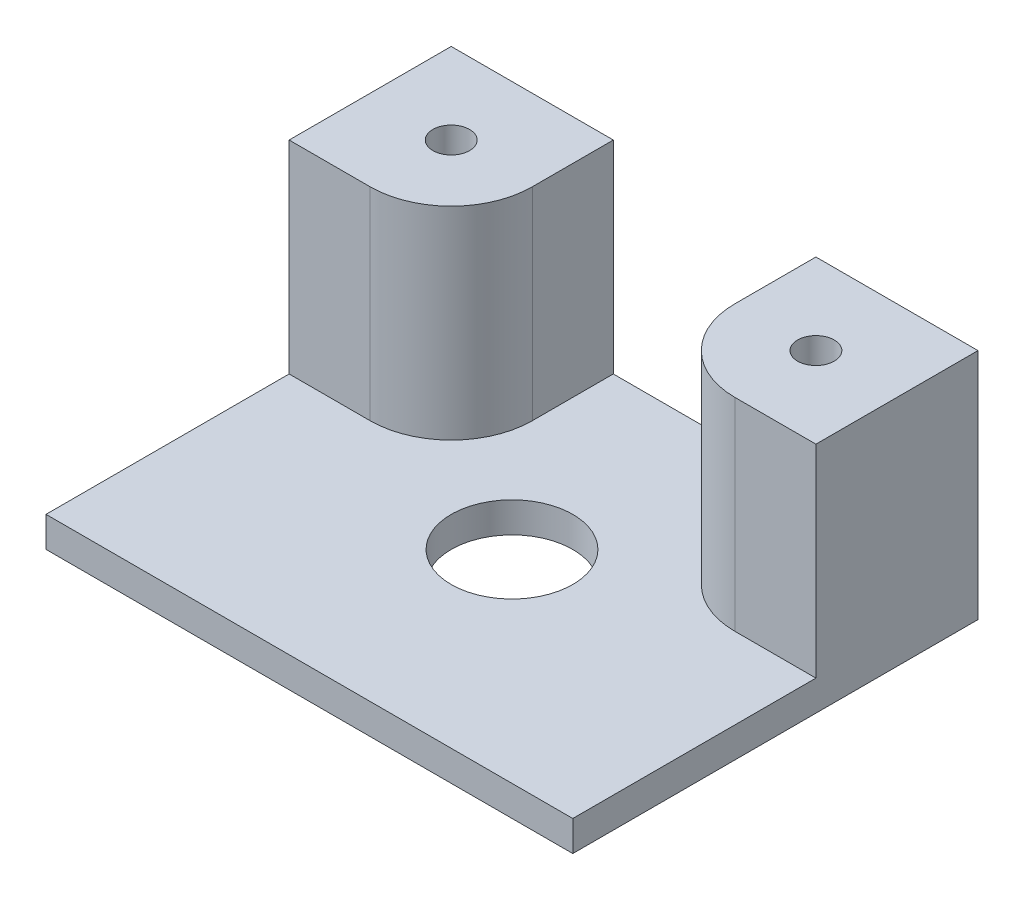
ISO-10303-21;
HEADER;
FILE_DESCRIPTION(('STEP AP214'),'2;1');
FILE_NAME('part.step','',(''),(''),'','','');
FILE_SCHEMA(('AUTOMOTIVE_DESIGN { 1 0 10303 214 1 1 1 1 }'));
ENDSEC;
DATA;
#1=APPLICATION_CONTEXT('core data for automotive mechanical design processes');
#2=APPLICATION_PROTOCOL_DEFINITION('international standard','automotive_design',2000,#1);
#3=PRODUCT_CONTEXT('',#1,'mechanical');
#4=PRODUCT('Part','Part','',(#3));
#5=PRODUCT_RELATED_PRODUCT_CATEGORY('part','',(#4));
#6=PRODUCT_DEFINITION_FORMATION('','',#4);
#7=PRODUCT_DEFINITION_CONTEXT('part definition',#1,'design');
#8=PRODUCT_DEFINITION('design','',#6,#7);
#9=PRODUCT_DEFINITION_SHAPE('','',#8);
#10=(LENGTH_UNIT() NAMED_UNIT(*) SI_UNIT(.MILLI.,.METRE.));
#11=(NAMED_UNIT(*) PLANE_ANGLE_UNIT() SI_UNIT($,.RADIAN.));
#12=(NAMED_UNIT(*) SI_UNIT($,.STERADIAN.) SOLID_ANGLE_UNIT());
#13=UNCERTAINTY_MEASURE_WITH_UNIT(LENGTH_MEASURE(1.E-05),#10,'distance_accuracy_value','');
#14=(GEOMETRIC_REPRESENTATION_CONTEXT(3) GLOBAL_UNCERTAINTY_ASSIGNED_CONTEXT((#13)) GLOBAL_UNIT_ASSIGNED_CONTEXT((#10,
#11,#12)) REPRESENTATION_CONTEXT('',''));
#15=CARTESIAN_POINT('',(0.,0.,0.));
#16=DIRECTION('',(0.,0.,1.));
#17=DIRECTION('',(1.,0.,0.));
#18=AXIS2_PLACEMENT_3D('',#15,#16,#17);
#19=CARTESIAN_POINT('',(-82.55,9.525,63.5));
#20=DIRECTION('',(1.,0.,0.));
#21=DIRECTION('',(0.,0.,-1.));
#22=AXIS2_PLACEMENT_3D('',#19,#20,#21);
#23=PLANE('',#22);
#24=DIRECTION('',(0.,0.,1.));
#25=VECTOR('',#24,1.);
#26=CARTESIAN_POINT('',(-82.55,0.,63.5));
#27=LINE('',#26,#25);
#28=CARTESIAN_POINT('',(-82.55,0.,-63.5));
#29=VERTEX_POINT('',#28);
#30=CARTESIAN_POINT('',(-82.55,0.,63.5));
#31=VERTEX_POINT('',#30);
#32=EDGE_CURVE('E197',#29,#31,#27,.T.);
#33=ORIENTED_EDGE('',*,*,#32,.T.);
#34=DIRECTION('',(0.,-1.,0.));
#35=VECTOR('',#34,1.);
#36=CARTESIAN_POINT('',(-82.55,9.525,63.5));
#37=LINE('',#36,#35);
#38=CARTESIAN_POINT('',(-82.55,9.525,63.5));
#39=VERTEX_POINT('',#38);
#40=EDGE_CURVE('E225',#39,#31,#37,.T.);
#41=ORIENTED_EDGE('',*,*,#40,.F.);
#42=DIRECTION('',(0.,0.,1.));
#43=VECTOR('',#42,1.);
#44=CARTESIAN_POINT('',(-82.55,9.525,63.5));
#45=LINE('',#44,#43);
#46=CARTESIAN_POINT('',(-82.55,9.525,-12.7));
#47=VERTEX_POINT('',#46);
#48=EDGE_CURVE('E200',#47,#39,#45,.T.);
#49=ORIENTED_EDGE('',*,*,#48,.F.);
#50=DIRECTION('',(0.,-1.,0.));
#51=VECTOR('',#50,1.);
#52=CARTESIAN_POINT('',(-82.55,73.025,-12.7));
#53=LINE('',#52,#51);
#54=CARTESIAN_POINT('',(-82.55,73.025,-12.7));
#55=VERTEX_POINT('',#54);
#56=EDGE_CURVE('E190',#55,#47,#53,.T.);
#57=ORIENTED_EDGE('',*,*,#56,.F.);
#58=DIRECTION('',(0.,0.,1.));
#59=VECTOR('',#58,1.);
#60=CARTESIAN_POINT('',(-82.55,73.025,-63.5));
#61=LINE('',#60,#59);
#62=CARTESIAN_POINT('',(-82.55,73.025,-63.5));
#63=VERTEX_POINT('',#62);
#64=EDGE_CURVE('E171',#63,#55,#61,.T.);
#65=ORIENTED_EDGE('',*,*,#64,.F.);
#66=DIRECTION('',(0.,-1.,0.));
#67=VECTOR('',#66,1.);
#68=CARTESIAN_POINT('',(-82.55,9.525,-63.5));
#69=LINE('',#68,#67);
#70=EDGE_CURVE('E209',#63,#29,#69,.T.);
#71=ORIENTED_EDGE('',*,*,#70,.T.);
#72=EDGE_LOOP('',(#33,#41,#49,#57,#65,#71));
#73=FACE_BOUND('',#72,.T.);
#74=ADVANCED_FACE('F38',(#73),#23,.F.);
#75=CARTESIAN_POINT('',(82.55,9.525,63.5));
#76=DIRECTION('',(0.,0.,-1.));
#77=DIRECTION('',(-1.,0.,0.));
#78=AXIS2_PLACEMENT_3D('',#75,#76,#77);
#79=PLANE('',#78);
#80=DIRECTION('',(1.,0.,0.));
#81=VECTOR('',#80,1.);
#82=CARTESIAN_POINT('',(82.55,0.,63.5));
#83=LINE('',#82,#81);
#84=CARTESIAN_POINT('',(82.55,0.,63.5));
#85=VERTEX_POINT('',#84);
#86=EDGE_CURVE('E212',#31,#85,#83,.T.);
#87=ORIENTED_EDGE('',*,*,#86,.T.);
#88=DIRECTION('',(0.,-1.,0.));
#89=VECTOR('',#88,1.);
#90=CARTESIAN_POINT('',(82.55,9.525,63.5));
#91=LINE('',#90,#89);
#92=CARTESIAN_POINT('',(82.55,9.525,63.5));
#93=VERTEX_POINT('',#92);
#94=EDGE_CURVE('E222',#93,#85,#91,.T.);
#95=ORIENTED_EDGE('',*,*,#94,.F.);
#96=DIRECTION('',(1.,0.,0.));
#97=VECTOR('',#96,1.);
#98=CARTESIAN_POINT('',(82.55,9.525,63.5));
#99=LINE('',#98,#97);
#100=EDGE_CURVE('E202',#39,#93,#99,.T.);
#101=ORIENTED_EDGE('',*,*,#100,.F.);
#102=ORIENTED_EDGE('',*,*,#40,.T.);
#103=EDGE_LOOP('',(#87,#95,#101,#102));
#104=FACE_BOUND('',#103,.T.);
#105=ADVANCED_FACE('F258',(#104),#79,.F.);
#106=CARTESIAN_POINT('',(82.55,9.525,63.5));
#107=DIRECTION('',(-1.,0.,0.));
#108=DIRECTION('',(0.,0.,1.));
#109=AXIS2_PLACEMENT_3D('',#106,#107,#108);
#110=PLANE('',#109);
#111=DIRECTION('',(0.,0.,-1.));
#112=VECTOR('',#111,1.);
#113=CARTESIAN_POINT('',(82.55,0.,63.5));
#114=LINE('',#113,#112);
#115=CARTESIAN_POINT('',(82.55,0.,-63.5));
#116=VERTEX_POINT('',#115);
#117=EDGE_CURVE('E214',#85,#116,#114,.T.);
#118=ORIENTED_EDGE('',*,*,#117,.T.);
#119=DIRECTION('',(0.,-1.,0.));
#120=VECTOR('',#119,1.);
#121=CARTESIAN_POINT('',(82.55,9.525,-63.5));
#122=LINE('',#121,#120);
#123=CARTESIAN_POINT('',(82.55,73.025,-63.5));
#124=VERTEX_POINT('',#123);
#125=EDGE_CURVE('E219',#124,#116,#122,.T.);
#126=ORIENTED_EDGE('',*,*,#125,.F.);
#127=DIRECTION('',(0.,0.,1.));
#128=VECTOR('',#127,1.);
#129=CARTESIAN_POINT('',(82.55,73.025,-63.5));
#130=LINE('',#129,#128);
#131=CARTESIAN_POINT('',(82.55,73.025,-12.7));
#132=VERTEX_POINT('',#131);
#133=EDGE_CURVE('E146',#124,#132,#130,.T.);
#134=ORIENTED_EDGE('',*,*,#133,.T.);
#135=DIRECTION('',(0.,-1.,0.));
#136=VECTOR('',#135,1.);
#137=CARTESIAN_POINT('',(82.55,73.025,-12.7));
#138=LINE('',#137,#136);
#139=CARTESIAN_POINT('',(82.55,9.525,-12.7));
#140=VERTEX_POINT('',#139);
#141=EDGE_CURVE('E156',#132,#140,#138,.T.);
#142=ORIENTED_EDGE('',*,*,#141,.T.);
#143=DIRECTION('',(0.,0.,-1.));
#144=VECTOR('',#143,1.);
#145=CARTESIAN_POINT('',(82.55,9.525,63.5));
#146=LINE('',#145,#144);
#147=EDGE_CURVE('E205',#93,#140,#146,.T.);
#148=ORIENTED_EDGE('',*,*,#147,.F.);
#149=ORIENTED_EDGE('',*,*,#94,.T.);
#150=EDGE_LOOP('',(#118,#126,#134,#142,#148,#149));
#151=FACE_BOUND('',#150,.T.);
#152=ADVANCED_FACE('F264',(#151),#110,.F.);
#153=CARTESIAN_POINT('',(82.55,9.525,-63.5));
#154=DIRECTION('',(0.,0.,1.));
#155=DIRECTION('',(1.,0.,0.));
#156=AXIS2_PLACEMENT_3D('',#153,#154,#155);
#157=PLANE('',#156);
#158=DIRECTION('',(-1.,0.,0.));
#159=VECTOR('',#158,1.);
#160=CARTESIAN_POINT('',(82.55,0.,-63.5));
#161=LINE('',#160,#159);
#162=EDGE_CURVE('E203',#116,#29,#161,.T.);
#163=ORIENTED_EDGE('',*,*,#162,.T.);
#164=ORIENTED_EDGE('',*,*,#70,.F.);
#165=DIRECTION('',(-1.,0.,0.));
#166=VECTOR('',#165,1.);
#167=CARTESIAN_POINT('',(-82.55,73.025,-63.5));
#168=LINE('',#167,#166);
#169=CARTESIAN_POINT('',(-31.75,73.025,-63.5));
#170=VERTEX_POINT('',#169);
#171=EDGE_CURVE('E180',#170,#63,#168,.T.);
#172=ORIENTED_EDGE('',*,*,#171,.F.);
#173=DIRECTION('',(0.,-1.,0.));
#174=VECTOR('',#173,1.);
#175=CARTESIAN_POINT('',(-31.75,73.025,-63.5));
#176=LINE('',#175,#174);
#177=CARTESIAN_POINT('',(-31.75,9.525,-63.5));
#178=VERTEX_POINT('',#177);
#179=EDGE_CURVE('E183',#170,#178,#176,.T.);
#180=ORIENTED_EDGE('',*,*,#179,.T.);
#181=DIRECTION('',(-1.,0.,0.));
#182=VECTOR('',#181,1.);
#183=CARTESIAN_POINT('',(82.55,9.525,-63.5));
#184=LINE('',#183,#182);
#185=CARTESIAN_POINT('',(31.75,9.525,-63.5));
#186=VERTEX_POINT('',#185);
#187=EDGE_CURVE('E207',#186,#178,#184,.T.);
#188=ORIENTED_EDGE('',*,*,#187,.F.);
#189=DIRECTION('',(0.,-1.,0.));
#190=VECTOR('',#189,1.);
#191=CARTESIAN_POINT('',(31.75,73.025,-63.5));
#192=LINE('',#191,#190);
#193=CARTESIAN_POINT('',(31.75,73.025,-63.5));
#194=VERTEX_POINT('',#193);
#195=EDGE_CURVE('E161',#194,#186,#192,.T.);
#196=ORIENTED_EDGE('',*,*,#195,.F.);
#197=DIRECTION('',(1.,0.,0.));
#198=VECTOR('',#197,1.);
#199=CARTESIAN_POINT('',(82.55,73.025,-63.5));
#200=LINE('',#199,#198);
#201=EDGE_CURVE('E149',#194,#124,#200,.T.);
#202=ORIENTED_EDGE('',*,*,#201,.T.);
#203=ORIENTED_EDGE('',*,*,#125,.T.);
#204=EDGE_LOOP('',(#163,#164,#172,#180,#188,#196,#202,#203));
#205=FACE_BOUND('',#204,.T.);
#206=ADVANCED_FACE('F294',(#205),#157,.F.);
#207=CARTESIAN_POINT('',(0.,9.525,0.));
#208=DIRECTION('',(0.,1.,0.));
#209=DIRECTION('',(0.,0.,1.));
#210=AXIS2_PLACEMENT_3D('',#207,#208,#209);
#211=PLANE('',#210);
#212=DIRECTION('',(-1.,0.,0.));
#213=VECTOR('',#212,1.);
#214=CARTESIAN_POINT('',(82.55,9.525,-12.7));
#215=LINE('',#214,#213);
#216=CARTESIAN_POINT('',(57.15,9.525,-12.7));
#217=VERTEX_POINT('',#216);
#218=EDGE_CURVE('E141',#140,#217,#215,.T.);
#219=ORIENTED_EDGE('',*,*,#218,.T.);
#220=CARTESIAN_POINT('',(57.15,9.52500000000001,-38.1));
#221=DIRECTION('',(0.,1.,0.));
#222=DIRECTION('',(0.,0.,1.));
#223=AXIS2_PLACEMENT_3D('',#220,#221,#222);
#224=CIRCLE('',#223,25.4);
#225=CARTESIAN_POINT('',(31.75,9.525,-38.1));
#226=VERTEX_POINT('',#225);
#227=EDGE_CURVE('E11',#217,#226,#224,.F.);
#228=ORIENTED_EDGE('',*,*,#227,.T.);
#229=DIRECTION('',(0.,0.,-1.));
#230=VECTOR('',#229,1.);
#231=CARTESIAN_POINT('',(31.75,9.525,-63.5));
#232=LINE('',#231,#230);
#233=EDGE_CURVE('E138',#226,#186,#232,.T.);
#234=ORIENTED_EDGE('',*,*,#233,.T.);
#235=ORIENTED_EDGE('',*,*,#187,.T.);
#236=DIRECTION('',(0.,0.,-1.));
#237=VECTOR('',#236,1.);
#238=CARTESIAN_POINT('',(-31.75,9.525,-63.5));
#239=LINE('',#238,#237);
#240=CARTESIAN_POINT('',(-31.75,9.525,-38.1));
#241=VERTEX_POINT('',#240);
#242=EDGE_CURVE('E175',#241,#178,#239,.T.);
#243=ORIENTED_EDGE('',*,*,#242,.F.);
#244=CARTESIAN_POINT('',(-57.15,9.52500000000001,-38.1));
#245=DIRECTION('',(0.,1.,0.));
#246=DIRECTION('',(0.,0.,1.));
#247=AXIS2_PLACEMENT_3D('',#244,#245,#246);
#248=CIRCLE('',#247,25.4);
#249=CARTESIAN_POINT('',(-57.15,9.525,-12.7));
#250=VERTEX_POINT('',#249);
#251=EDGE_CURVE('E235',#241,#250,#248,.F.);
#252=ORIENTED_EDGE('',*,*,#251,.T.);
#253=DIRECTION('',(1.,0.,0.));
#254=VECTOR('',#253,1.);
#255=CARTESIAN_POINT('',(-82.55,9.525,-12.7));
#256=LINE('',#255,#254);
#257=EDGE_CURVE('E170',#47,#250,#256,.T.);
#258=ORIENTED_EDGE('',*,*,#257,.F.);
#259=ORIENTED_EDGE('',*,*,#48,.T.);
#260=ORIENTED_EDGE('',*,*,#100,.T.);
#261=ORIENTED_EDGE('',*,*,#147,.T.);
#262=EDGE_LOOP('',(#219,#228,#234,#235,#243,#252,#258,#259,#260,#261));
#263=FACE_BOUND('',#262,.T.);
#264=CARTESIAN_POINT('',(0.,9.525,0.));
#265=DIRECTION('',(0.,1.,0.));
#266=DIRECTION('',(0.,0.,1.));
#267=AXIS2_PLACEMENT_3D('',#264,#265,#266);
#268=CIRCLE('',#267,19.05);
#269=CARTESIAN_POINT('',(0.,9.525,19.05));
#270=VERTEX_POINT('',#269);
#271=EDGE_CURVE('E193',#270,#270,#268,.T.);
#272=ORIENTED_EDGE('',*,*,#271,.F.);
#273=EDGE_LOOP('',(#272));
#274=FACE_BOUND('',#273,.T.);
#275=ADVANCED_FACE('F302',(#263,#274),#211,.T.);
#276=CARTESIAN_POINT('',(0.,0.,0.));
#277=DIRECTION('',(0.,1.,0.));
#278=DIRECTION('',(0.,0.,1.));
#279=AXIS2_PLACEMENT_3D('',#276,#277,#278);
#280=PLANE('',#279);
#281=CARTESIAN_POINT('',(0.,0.,0.));
#282=DIRECTION('',(0.,1.,0.));
#283=DIRECTION('',(0.,0.,1.));
#284=AXIS2_PLACEMENT_3D('',#281,#282,#283);
#285=CIRCLE('',#284,19.05);
#286=CARTESIAN_POINT('',(0.,0.,19.05));
#287=VERTEX_POINT('',#286);
#288=EDGE_CURVE('E194',#287,#287,#285,.T.);
#289=ORIENTED_EDGE('',*,*,#288,.T.);
#290=EDGE_LOOP('',(#289));
#291=FACE_BOUND('',#290,.T.);
#292=ORIENTED_EDGE('',*,*,#32,.F.);
#293=ORIENTED_EDGE('',*,*,#162,.F.);
#294=ORIENTED_EDGE('',*,*,#117,.F.);
#295=ORIENTED_EDGE('',*,*,#86,.F.);
#296=EDGE_LOOP('',(#292,#293,#294,#295));
#297=FACE_BOUND('',#296,.T.);
#298=ADVANCED_FACE('F324',(#291,#297),#280,.F.);
#299=CARTESIAN_POINT('',(0.,0.,0.));
#300=DIRECTION('',(0.,1.,0.));
#301=DIRECTION('',(0.,0.,1.));
#302=AXIS2_PLACEMENT_3D('',#299,#300,#301);
#303=CYLINDRICAL_SURFACE('',#302,19.05);
#304=CARTESIAN_POINT('',(0.,0.,19.05));
#305=CARTESIAN_POINT('',(0.,0.0992187499999999,19.05));
#306=CARTESIAN_POINT('',(0.,0.1984375,19.05));
#307=CARTESIAN_POINT('',(0.,0.396875,19.05));
#308=CARTESIAN_POINT('',(0.,0.49609375,19.05));
#309=CARTESIAN_POINT('',(0.,0.69453125,19.05));
#310=CARTESIAN_POINT('',(0.,0.79375,19.05));
#311=CARTESIAN_POINT('',(0.,0.9921875,19.05));
#312=CARTESIAN_POINT('',(0.,1.09140625,19.05));
#313=CARTESIAN_POINT('',(0.,1.28984375,19.05));
#314=CARTESIAN_POINT('',(0.,1.3890625,19.05));
#315=CARTESIAN_POINT('',(0.,1.5875,19.05));
#316=CARTESIAN_POINT('',(0.,1.68671875,19.05));
#317=CARTESIAN_POINT('',(0.,1.88515625,19.05));
#318=CARTESIAN_POINT('',(0.,1.984375,19.05));
#319=CARTESIAN_POINT('',(0.,2.1828125,19.05));
#320=CARTESIAN_POINT('',(0.,2.28203125,19.05));
#321=CARTESIAN_POINT('',(0.,2.48046875,19.05));
#322=CARTESIAN_POINT('',(0.,2.5796875,19.05));
#323=CARTESIAN_POINT('',(0.,2.778125,19.05));
#324=CARTESIAN_POINT('',(0.,2.87734375,19.05));
#325=CARTESIAN_POINT('',(0.,3.07578125,19.05));
#326=CARTESIAN_POINT('',(0.,3.175,19.05));
#327=CARTESIAN_POINT('',(0.,3.3734375,19.05));
#328=CARTESIAN_POINT('',(0.,3.47265625,19.05));
#329=CARTESIAN_POINT('',(0.,3.67109375,19.05));
#330=CARTESIAN_POINT('',(0.,3.7703125,19.05));
#331=CARTESIAN_POINT('',(0.,3.96875,19.05));
#332=CARTESIAN_POINT('',(0.,4.06796875,19.05));
#333=CARTESIAN_POINT('',(0.,4.26640625,19.05));
#334=CARTESIAN_POINT('',(0.,4.365625,19.05));
#335=CARTESIAN_POINT('',(0.,4.5640625,19.05));
#336=CARTESIAN_POINT('',(0.,4.66328125,19.05));
#337=CARTESIAN_POINT('',(0.,4.86171875,19.05));
#338=CARTESIAN_POINT('',(0.,4.9609375,19.05));
#339=CARTESIAN_POINT('',(0.,5.159375,19.05));
#340=CARTESIAN_POINT('',(0.,5.25859375,19.05));
#341=CARTESIAN_POINT('',(0.,5.45703125,19.05));
#342=CARTESIAN_POINT('',(0.,5.55625,19.05));
#343=CARTESIAN_POINT('',(0.,5.7546875,19.05));
#344=CARTESIAN_POINT('',(0.,5.85390625,19.05));
#345=CARTESIAN_POINT('',(0.,6.05234375,19.05));
#346=CARTESIAN_POINT('',(0.,6.1515625,19.05));
#347=CARTESIAN_POINT('',(0.,6.35,19.05));
#348=CARTESIAN_POINT('',(0.,6.44921875,19.05));
#349=CARTESIAN_POINT('',(0.,6.64765625,19.05));
#350=CARTESIAN_POINT('',(0.,6.746875,19.05));
#351=CARTESIAN_POINT('',(0.,6.9453125,19.05));
#352=CARTESIAN_POINT('',(0.,7.04453125,19.05));
#353=CARTESIAN_POINT('',(0.,7.24296875,19.05));
#354=CARTESIAN_POINT('',(0.,7.3421875,19.05));
#355=CARTESIAN_POINT('',(0.,7.540625,19.05));
#356=CARTESIAN_POINT('',(0.,7.63984375,19.05));
#357=CARTESIAN_POINT('',(0.,7.83828125,19.05));
#358=CARTESIAN_POINT('',(0.,7.9375,19.05));
#359=CARTESIAN_POINT('',(0.,8.1359375,19.05));
#360=CARTESIAN_POINT('',(0.,8.23515625,19.05));
#361=CARTESIAN_POINT('',(0.,8.43359375,19.05));
#362=CARTESIAN_POINT('',(0.,8.5328125,19.05));
#363=CARTESIAN_POINT('',(0.,8.73125,19.05));
#364=CARTESIAN_POINT('',(0.,8.83046875,19.05));
#365=CARTESIAN_POINT('',(0.,9.02890625,19.05));
#366=CARTESIAN_POINT('',(0.,9.128125,19.05));
#367=CARTESIAN_POINT('',(0.,9.3265625,19.05));
#368=CARTESIAN_POINT('',(0.,9.42578125,19.05));
#369=CARTESIAN_POINT('',(0.,9.525,19.05));
#370=B_SPLINE_CURVE_WITH_KNOTS('',3,(#304,#305,#306,#307,#308,#309,#310,#311,#312,#313,#314,
#315,#316,#317,#318,#319,#320,#321,#322,#323,#324,#325,#326,#327,#328,#329,#330,#331,#332,#333,
#334,#335,#336,#337,#338,#339,#340,#341,#342,#343,#344,#345,#346,#347,#348,#349,#350,#351,#352,
#353,#354,#355,#356,#357,#358,#359,#360,#361,#362,#363,#364,#365,#366,#367,#368,#369),
.UNSPECIFIED.,.F.,.F.,(4,2,2,2,2,2,2,2,2,2,2,2,2,2,2,2,2,2,2,2,2,2,2,2,2,2,2,2,2,2,2,2,4),(0.,
0.29765625,0.5953125,0.89296875,1.190625,1.48828125,1.7859375,2.08359375,2.38125,2.67890625,
2.9765625,3.27421875,3.571875,3.86953125,4.1671875,4.46484375,4.7625,5.06015625,5.3578125,
5.65546875,5.953125,6.25078125,6.5484375,6.84609375,7.14375,7.44140625,7.7390625,8.03671875,
8.334375,8.63203125,8.9296875,9.22734375,9.525),.UNSPECIFIED.);
#371=EDGE_CURVE('BSEAM321',#287,#270,#370,.T.);
#372=ORIENTED_EDGE('',*,*,#288,.F.);
#373=ORIENTED_EDGE('',*,*,#271,.T.);
#374=ORIENTED_EDGE('',*,*,#371,.T.);
#375=ORIENTED_EDGE('',*,*,#371,.F.);
#376=EDGE_LOOP('',(#372,#374,#373,#375));
#377=FACE_BOUND('',#376,.T.);
#378=ADVANCED_FACE('F321',(#377),#303,.F.);
#379=CARTESIAN_POINT('',(-82.55,73.025,-12.7));
#380=DIRECTION('',(0.,0.,-1.));
#381=DIRECTION('',(-1.,0.,0.));
#382=AXIS2_PLACEMENT_3D('',#379,#380,#381);
#383=PLANE('',#382);
#384=ORIENTED_EDGE('',*,*,#257,.T.);
#385=DIRECTION('',(0.,-1.,0.));
#386=VECTOR('',#385,1.);
#387=CARTESIAN_POINT('',(-57.15,73.025,-12.7));
#388=LINE('',#387,#386);
#389=CARTESIAN_POINT('',(-57.15,73.025,-12.7));
#390=VERTEX_POINT('',#389);
#391=EDGE_CURVE('E231',#250,#390,#388,.F.);
#392=ORIENTED_EDGE('',*,*,#391,.T.);
#393=DIRECTION('',(1.,0.,0.));
#394=VECTOR('',#393,1.);
#395=CARTESIAN_POINT('',(-82.55,73.025,-12.7));
#396=LINE('',#395,#394);
#397=EDGE_CURVE('E174',#55,#390,#396,.T.);
#398=ORIENTED_EDGE('',*,*,#397,.F.);
#399=ORIENTED_EDGE('',*,*,#56,.T.);
#400=EDGE_LOOP('',(#384,#392,#398,#399));
#401=FACE_BOUND('',#400,.T.);
#402=ADVANCED_FACE('F301',(#401),#383,.F.);
#403=CARTESIAN_POINT('',(-31.75,73.025,-63.5));
#404=DIRECTION('',(-1.,0.,0.));
#405=DIRECTION('',(0.,0.,1.));
#406=AXIS2_PLACEMENT_3D('',#403,#404,#405);
#407=PLANE('',#406);
#408=DIRECTION('',(0.,0.,-1.));
#409=VECTOR('',#408,1.);
#410=CARTESIAN_POINT('',(-31.75,73.025,-63.5));
#411=LINE('',#410,#409);
#412=CARTESIAN_POINT('',(-31.75,73.025,-38.1));
#413=VERTEX_POINT('',#412);
#414=EDGE_CURVE('E178',#413,#170,#411,.T.);
#415=ORIENTED_EDGE('',*,*,#414,.F.);
#416=DIRECTION('',(0.,-1.,0.));
#417=VECTOR('',#416,1.);
#418=CARTESIAN_POINT('',(-31.75,73.025,-38.1));
#419=LINE('',#418,#417);
#420=EDGE_CURVE('E228',#413,#241,#419,.T.);
#421=ORIENTED_EDGE('',*,*,#420,.T.);
#422=ORIENTED_EDGE('',*,*,#242,.T.);
#423=ORIENTED_EDGE('',*,*,#179,.F.);
#424=EDGE_LOOP('',(#415,#421,#422,#423));
#425=FACE_BOUND('',#424,.T.);
#426=ADVANCED_FACE('F280',(#425),#407,.F.);
#427=CARTESIAN_POINT('',(0.,73.025,0.));
#428=DIRECTION('',(0.,1.,0.));
#429=DIRECTION('',(0.,0.,1.));
#430=AXIS2_PLACEMENT_3D('',#427,#428,#429);
#431=PLANE('',#430);
#432=CARTESIAN_POINT('',(-57.15,73.025,-38.1));
#433=DIRECTION('',(0.,1.,0.));
#434=DIRECTION('',(0.,0.,1.));
#435=AXIS2_PLACEMENT_3D('',#432,#433,#434);
#436=CIRCLE('',#435,5.75436999999999);
#437=CARTESIAN_POINT('',(-57.15,73.025,-32.34563));
#438=VERTEX_POINT('',#437);
#439=EDGE_CURVE('E164',#438,#438,#436,.T.);
#440=ORIENTED_EDGE('',*,*,#439,.F.);
#441=EDGE_LOOP('',(#440));
#442=FACE_BOUND('',#441,.T.);
#443=ORIENTED_EDGE('',*,*,#397,.T.);
#444=CARTESIAN_POINT('',(-57.15,73.025,-38.1));
#445=DIRECTION('',(0.,1.,0.));
#446=DIRECTION('',(0.,0.,1.));
#447=AXIS2_PLACEMENT_3D('',#444,#445,#446);
#448=CIRCLE('',#447,25.4);
#449=EDGE_CURVE('E233',#390,#413,#448,.T.);
#450=ORIENTED_EDGE('',*,*,#449,.T.);
#451=ORIENTED_EDGE('',*,*,#414,.T.);
#452=ORIENTED_EDGE('',*,*,#171,.T.);
#453=ORIENTED_EDGE('',*,*,#64,.T.);
#454=EDGE_LOOP('',(#443,#450,#451,#452,#453));
#455=FACE_BOUND('',#454,.T.);
#456=ADVANCED_FACE('F271',(#442,#455),#431,.T.);
#457=CARTESIAN_POINT('',(-57.15,73.025,-38.1));
#458=DIRECTION('',(0.,-1.,0.));
#459=DIRECTION('',(0.,0.,-1.));
#460=AXIS2_PLACEMENT_3D('',#457,#458,#459);
#461=CYLINDRICAL_SURFACE('',#460,25.4);
#462=ORIENTED_EDGE('',*,*,#449,.F.);
#463=ORIENTED_EDGE('',*,*,#391,.F.);
#464=ORIENTED_EDGE('',*,*,#251,.F.);
#465=ORIENTED_EDGE('',*,*,#420,.F.);
#466=EDGE_LOOP('',(#462,#463,#464,#465));
#467=FACE_BOUND('',#466,.T.);
#468=ADVANCED_FACE('F268',(#467),#461,.T.);
#469=CARTESIAN_POINT('',(-57.15,41.275,-38.1));
#470=DIRECTION('',(0.,1.,0.));
#471=DIRECTION('',(0.,0.,1.));
#472=AXIS2_PLACEMENT_3D('',#469,#470,#471);
#473=CONICAL_SURFACE('',#472,5.75436999999999,1.02974425867665);
#474=CARTESIAN_POINT('',(-57.15,37.8174256796864,-38.1));
#475=VERTEX_POINT('',#474);
#476=VERTEX_LOOP('',#475);
#477=FACE_BOUND('',#476,.T.);
#478=CARTESIAN_POINT('',(-57.15,41.275,-38.1));
#479=DIRECTION('',(0.,1.,0.));
#480=DIRECTION('',(0.,0.,1.));
#481=AXIS2_PLACEMENT_3D('',#478,#479,#480);
#482=CIRCLE('',#481,5.75436999999999);
#483=CARTESIAN_POINT('',(-57.15,41.275,-32.34563));
#484=VERTEX_POINT('',#483);
#485=EDGE_CURVE('E167',#484,#484,#482,.T.);
#486=ORIENTED_EDGE('',*,*,#485,.T.);
#487=EDGE_LOOP('',(#486));
#488=FACE_BOUND('',#487,.T.);
#489=ADVANCED_FACE('F270',(#477,#488),#473,.F.);
#490=CARTESIAN_POINT('',(-57.15,73.025,-38.1));
#491=DIRECTION('',(0.,1.,0.));
#492=DIRECTION('',(0.,0.,1.));
#493=AXIS2_PLACEMENT_3D('',#490,#491,#492);
#494=CYLINDRICAL_SURFACE('',#493,5.75436999999999);
#495=ORIENTED_EDGE('',*,*,#485,.F.);
#496=EDGE_LOOP('',(#495));
#497=FACE_BOUND('',#496,.T.);
#498=ORIENTED_EDGE('',*,*,#439,.T.);
#499=EDGE_LOOP('',(#498));
#500=FACE_BOUND('',#499,.T.);
#501=ADVANCED_FACE('F277',(#497,#500),#494,.F.);
#502=CARTESIAN_POINT('',(31.75,73.025,-63.5));
#503=DIRECTION('',(-1.,0.,0.));
#504=DIRECTION('',(0.,0.,1.));
#505=AXIS2_PLACEMENT_3D('',#502,#503,#504);
#506=PLANE('',#505);
#507=ORIENTED_EDGE('',*,*,#233,.F.);
#508=DIRECTION('',(0.,-1.,0.));
#509=VECTOR('',#508,1.);
#510=CARTESIAN_POINT('',(31.75,73.025,-38.1));
#511=LINE('',#510,#509);
#512=CARTESIAN_POINT('',(31.75,73.025,-38.1));
#513=VERTEX_POINT('',#512);
#514=EDGE_CURVE('E53',#226,#513,#511,.F.);
#515=ORIENTED_EDGE('',*,*,#514,.T.);
#516=DIRECTION('',(0.,0.,-1.));
#517=VECTOR('',#516,1.);
#518=CARTESIAN_POINT('',(31.75,73.025,-63.5));
#519=LINE('',#518,#517);
#520=EDGE_CURVE('E152',#513,#194,#519,.T.);
#521=ORIENTED_EDGE('',*,*,#520,.T.);
#522=ORIENTED_EDGE('',*,*,#195,.T.);
#523=EDGE_LOOP('',(#507,#515,#521,#522));
#524=FACE_BOUND('',#523,.T.);
#525=ADVANCED_FACE('F306',(#524),#506,.T.);
#526=CARTESIAN_POINT('',(82.55,73.025,-12.7));
#527=DIRECTION('',(0.,0.,1.));
#528=DIRECTION('',(1.,0.,0.));
#529=AXIS2_PLACEMENT_3D('',#526,#527,#528);
#530=PLANE('',#529);
#531=DIRECTION('',(-1.,0.,0.));
#532=VECTOR('',#531,1.);
#533=CARTESIAN_POINT('',(82.55,73.025,-12.7));
#534=LINE('',#533,#532);
#535=CARTESIAN_POINT('',(57.15,73.025,-12.7));
#536=VERTEX_POINT('',#535);
#537=EDGE_CURVE('E154',#132,#536,#534,.T.);
#538=ORIENTED_EDGE('',*,*,#537,.T.);
#539=DIRECTION('',(0.,-1.,0.));
#540=VECTOR('',#539,1.);
#541=CARTESIAN_POINT('',(57.15,73.025,-12.7));
#542=LINE('',#541,#540);
#543=EDGE_CURVE('E237',#536,#217,#542,.T.);
#544=ORIENTED_EDGE('',*,*,#543,.T.);
#545=ORIENTED_EDGE('',*,*,#218,.F.);
#546=ORIENTED_EDGE('',*,*,#141,.F.);
#547=EDGE_LOOP('',(#538,#544,#545,#546));
#548=FACE_BOUND('',#547,.T.);
#549=ADVANCED_FACE('F249',(#548),#530,.T.);
#550=CARTESIAN_POINT('',(0.,73.025,0.));
#551=DIRECTION('',(0.,1.,0.));
#552=DIRECTION('',(0.,0.,1.));
#553=AXIS2_PLACEMENT_3D('',#550,#551,#552);
#554=PLANE('',#553);
#555=CARTESIAN_POINT('',(57.15,73.025,-38.1));
#556=DIRECTION('',(0.,1.,0.));
#557=DIRECTION('',(0.,0.,1.));
#558=AXIS2_PLACEMENT_3D('',#555,#556,#557);
#559=CIRCLE('',#558,5.75436999999998);
#560=CARTESIAN_POINT('',(57.15,73.025,-32.34563));
#561=VERTEX_POINT('',#560);
#562=EDGE_CURVE('E139',#561,#561,#559,.T.);
#563=ORIENTED_EDGE('',*,*,#562,.F.);
#564=EDGE_LOOP('',(#563));
#565=FACE_BOUND('',#564,.T.);
#566=ORIENTED_EDGE('',*,*,#520,.F.);
#567=CARTESIAN_POINT('',(57.15,73.025,-38.1));
#568=DIRECTION('',(0.,1.,0.));
#569=DIRECTION('',(0.,0.,1.));
#570=AXIS2_PLACEMENT_3D('',#567,#568,#569);
#571=CIRCLE('',#570,25.4);
#572=EDGE_CURVE('E46',#513,#536,#571,.T.);
#573=ORIENTED_EDGE('',*,*,#572,.T.);
#574=ORIENTED_EDGE('',*,*,#537,.F.);
#575=ORIENTED_EDGE('',*,*,#133,.F.);
#576=ORIENTED_EDGE('',*,*,#201,.F.);
#577=EDGE_LOOP('',(#566,#573,#574,#575,#576));
#578=FACE_BOUND('',#577,.T.);
#579=ADVANCED_FACE('F243',(#565,#578),#554,.T.);
#580=CARTESIAN_POINT('',(57.15,73.025,-38.1));
#581=DIRECTION('',(0.,-1.,0.));
#582=DIRECTION('',(0.,0.,-1.));
#583=AXIS2_PLACEMENT_3D('',#580,#581,#582);
#584=CYLINDRICAL_SURFACE('',#583,25.4);
#585=ORIENTED_EDGE('',*,*,#572,.F.);
#586=ORIENTED_EDGE('',*,*,#514,.F.);
#587=ORIENTED_EDGE('',*,*,#227,.F.);
#588=ORIENTED_EDGE('',*,*,#543,.F.);
#589=EDGE_LOOP('',(#585,#586,#587,#588));
#590=FACE_BOUND('',#589,.T.);
#591=ADVANCED_FACE('F40',(#590),#584,.T.);
#592=CARTESIAN_POINT('',(57.15,41.275,-38.1));
#593=DIRECTION('',(0.,1.,0.));
#594=DIRECTION('',(0.,0.,1.));
#595=AXIS2_PLACEMENT_3D('',#592,#593,#594);
#596=CONICAL_SURFACE('',#595,5.75436999999999,1.02974425867665);
#597=CARTESIAN_POINT('',(57.15,37.8174256796864,-38.1));
#598=VERTEX_POINT('',#597);
#599=VERTEX_LOOP('',#598);
#600=FACE_BOUND('',#599,.T.);
#601=CARTESIAN_POINT('',(57.15,41.275,-38.1));
#602=DIRECTION('',(0.,1.,0.));
#603=DIRECTION('',(0.,0.,1.));
#604=AXIS2_PLACEMENT_3D('',#601,#602,#603);
#605=CIRCLE('',#604,5.75436999999999);
#606=CARTESIAN_POINT('',(57.15,41.275,-32.34563));
#607=VERTEX_POINT('',#606);
#608=EDGE_CURVE('E136',#607,#607,#605,.T.);
#609=ORIENTED_EDGE('',*,*,#608,.T.);
#610=EDGE_LOOP('',(#609));
#611=FACE_BOUND('',#610,.T.);
#612=ADVANCED_FACE('F129',(#600,#611),#596,.F.);
#613=CARTESIAN_POINT('',(57.15,73.025,-38.1));
#614=DIRECTION('',(0.,1.,0.));
#615=DIRECTION('',(0.,0.,1.));
#616=AXIS2_PLACEMENT_3D('',#613,#614,#615);
#617=CYLINDRICAL_SURFACE('',#616,5.75436999999999);
#618=ORIENTED_EDGE('',*,*,#608,.F.);
#619=EDGE_LOOP('',(#618));
#620=FACE_BOUND('',#619,.T.);
#621=ORIENTED_EDGE('',*,*,#562,.T.);
#622=EDGE_LOOP('',(#621));
#623=FACE_BOUND('',#622,.T.);
#624=ADVANCED_FACE('F132',(#620,#623),#617,.F.);
#625=CLOSED_SHELL('',(#74,#105,#152,#206,#275,#298,#378,#402,#426,#456,#468,#489,#501,#525,#549,
#579,#591,#612,#624));
#626=MANIFOLD_SOLID_BREP('B2',#625);
#627=ADVANCED_BREP_SHAPE_REPRESENTATION('',(#18,#626),#14);
#628=SHAPE_DEFINITION_REPRESENTATION(#9,#627);
ENDSEC;
END-ISO-10303-21;
